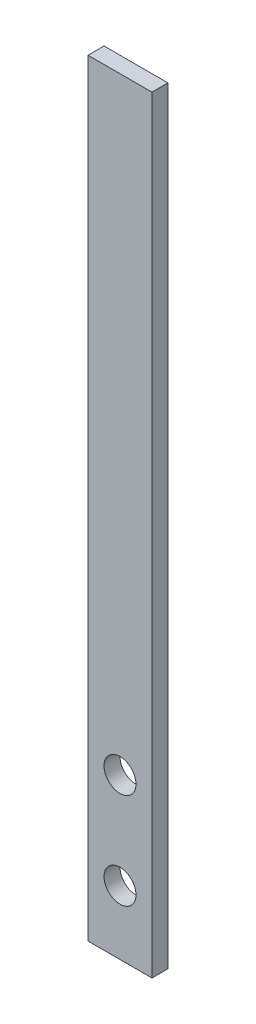
ISO-10303-21;
HEADER;
FILE_DESCRIPTION(('STEP AP214'),'2;1');
FILE_NAME('part.step','',(''),(''),'','','');
FILE_SCHEMA(('AUTOMOTIVE_DESIGN { 1 0 10303 214 1 1 1 1 }'));
ENDSEC;
DATA;
#1=APPLICATION_CONTEXT('core data for automotive mechanical design processes');
#2=APPLICATION_PROTOCOL_DEFINITION('international standard','automotive_design',2000,#1);
#3=PRODUCT_CONTEXT('',#1,'mechanical');
#4=PRODUCT('Part','Part','',(#3));
#5=PRODUCT_RELATED_PRODUCT_CATEGORY('part','',(#4));
#6=PRODUCT_DEFINITION_FORMATION('','',#4);
#7=PRODUCT_DEFINITION_CONTEXT('part definition',#1,'design');
#8=PRODUCT_DEFINITION('design','',#6,#7);
#9=PRODUCT_DEFINITION_SHAPE('','',#8);
#10=(LENGTH_UNIT() NAMED_UNIT(*) SI_UNIT(.MILLI.,.METRE.));
#11=(NAMED_UNIT(*) PLANE_ANGLE_UNIT() SI_UNIT($,.RADIAN.));
#12=(NAMED_UNIT(*) SI_UNIT($,.STERADIAN.) SOLID_ANGLE_UNIT());
#13=UNCERTAINTY_MEASURE_WITH_UNIT(LENGTH_MEASURE(1.E-05),#10,'distance_accuracy_value','');
#14=(GEOMETRIC_REPRESENTATION_CONTEXT(3) GLOBAL_UNCERTAINTY_ASSIGNED_CONTEXT((#13)) GLOBAL_UNIT_ASSIGNED_CONTEXT((#10,
#11,#12)) REPRESENTATION_CONTEXT('',''));
#15=CARTESIAN_POINT('',(0.,0.,0.));
#16=DIRECTION('',(0.,0.,1.));
#17=DIRECTION('',(1.,0.,0.));
#18=AXIS2_PLACEMENT_3D('',#15,#16,#17);
#19=CARTESIAN_POINT('',(0.,304.8,0.));
#20=DIRECTION('',(0.,0.,-1.));
#21=DIRECTION('',(-1.,0.,0.));
#22=AXIS2_PLACEMENT_3D('',#19,#20,#21);
#23=PLANE('',#22);
#24=CARTESIAN_POINT('',(12.7,63.5,0.));
#25=DIRECTION('',(0.,0.,1.));
#26=DIRECTION('',(1.,0.,0.));
#27=AXIS2_PLACEMENT_3D('',#24,#25,#26);
#28=CIRCLE('',#27,6.35);
#29=CARTESIAN_POINT('',(19.05,63.5,0.));
#30=VERTEX_POINT('',#29);
#31=EDGE_CURVE('E120',#30,#30,#28,.T.);
#32=ORIENTED_EDGE('',*,*,#31,.F.);
#33=EDGE_LOOP('',(#32));
#34=FACE_BOUND('',#33,.T.);
#35=CARTESIAN_POINT('',(12.7,25.4,0.));
#36=DIRECTION('',(0.,0.,1.));
#37=DIRECTION('',(1.,0.,0.));
#38=AXIS2_PLACEMENT_3D('',#35,#36,#37);
#39=CIRCLE('',#38,6.35);
#40=CARTESIAN_POINT('',(19.05,25.4,0.));
#41=VERTEX_POINT('',#40);
#42=EDGE_CURVE('E112',#41,#41,#39,.T.);
#43=ORIENTED_EDGE('',*,*,#42,.F.);
#44=EDGE_LOOP('',(#43));
#45=FACE_BOUND('',#44,.T.);
#46=DIRECTION('',(1.,0.,0.));
#47=VECTOR('',#46,1.);
#48=CARTESIAN_POINT('',(0.,0.,0.));
#49=LINE('',#48,#47);
#50=CARTESIAN_POINT('',(0.,0.,0.));
#51=VERTEX_POINT('',#50);
#52=CARTESIAN_POINT('',(25.4,0.,0.));
#53=VERTEX_POINT('',#52);
#54=EDGE_CURVE('E101',#51,#53,#49,.T.);
#55=ORIENTED_EDGE('',*,*,#54,.T.);
#56=DIRECTION('',(0.,-1.,0.));
#57=VECTOR('',#56,1.);
#58=CARTESIAN_POINT('',(25.4,304.8,0.));
#59=LINE('',#58,#57);
#60=CARTESIAN_POINT('',(25.4,304.8,0.));
#61=VERTEX_POINT('',#60);
#62=EDGE_CURVE('E11',#61,#53,#59,.T.);
#63=ORIENTED_EDGE('',*,*,#62,.F.);
#64=DIRECTION('',(1.,0.,0.));
#65=VECTOR('',#64,1.);
#66=CARTESIAN_POINT('',(0.,304.8,0.));
#67=LINE('',#66,#65);
#68=CARTESIAN_POINT('',(0.,304.8,0.));
#69=VERTEX_POINT('',#68);
#70=EDGE_CURVE('E86',#69,#61,#67,.T.);
#71=ORIENTED_EDGE('',*,*,#70,.F.);
#72=DIRECTION('',(0.,-1.,0.));
#73=VECTOR('',#72,1.);
#74=CARTESIAN_POINT('',(0.,304.8,0.));
#75=LINE('',#74,#73);
#76=EDGE_CURVE('E53',#69,#51,#75,.T.);
#77=ORIENTED_EDGE('',*,*,#76,.T.);
#78=EDGE_LOOP('',(#55,#63,#71,#77));
#79=FACE_BOUND('',#78,.T.);
#80=ADVANCED_FACE('F35',(#34,#45,#79),#23,.F.);
#81=CARTESIAN_POINT('',(25.4,304.8,0.));
#82=DIRECTION('',(-1.,0.,0.));
#83=DIRECTION('',(0.,0.,1.));
#84=AXIS2_PLACEMENT_3D('',#81,#82,#83);
#85=PLANE('',#84);
#86=DIRECTION('',(0.,0.,-1.));
#87=VECTOR('',#86,1.);
#88=CARTESIAN_POINT('',(25.4,0.,0.));
#89=LINE('',#88,#87);
#90=CARTESIAN_POINT('',(25.4,0.,-6.35));
#91=VERTEX_POINT('',#90);
#92=EDGE_CURVE('E91',#53,#91,#89,.T.);
#93=ORIENTED_EDGE('',*,*,#92,.T.);
#94=DIRECTION('',(0.,-1.,0.));
#95=VECTOR('',#94,1.);
#96=CARTESIAN_POINT('',(25.4,304.8,-6.35));
#97=LINE('',#96,#95);
#98=CARTESIAN_POINT('',(25.4,304.8,-6.35));
#99=VERTEX_POINT('',#98);
#100=EDGE_CURVE('E44',#99,#91,#97,.T.);
#101=ORIENTED_EDGE('',*,*,#100,.F.);
#102=DIRECTION('',(0.,0.,-1.));
#103=VECTOR('',#102,1.);
#104=CARTESIAN_POINT('',(25.4,304.8,0.));
#105=LINE('',#104,#103);
#106=EDGE_CURVE('E78',#61,#99,#105,.T.);
#107=ORIENTED_EDGE('',*,*,#106,.F.);
#108=ORIENTED_EDGE('',*,*,#62,.T.);
#109=EDGE_LOOP('',(#93,#101,#107,#108));
#110=FACE_BOUND('',#109,.T.);
#111=ADVANCED_FACE('F90',(#110),#85,.F.);
#112=CARTESIAN_POINT('',(0.,304.8,-6.35));
#113=DIRECTION('',(0.,0.,-1.));
#114=DIRECTION('',(-1.,0.,0.));
#115=AXIS2_PLACEMENT_3D('',#112,#113,#114);
#116=PLANE('',#115);
#117=CARTESIAN_POINT('',(12.7,63.5,-6.35000000000002));
#118=DIRECTION('',(0.,0.,-1.));
#119=DIRECTION('',(-1.,0.,0.));
#120=AXIS2_PLACEMENT_3D('',#117,#118,#119);
#121=CIRCLE('',#120,6.35);
#122=CARTESIAN_POINT('',(6.35,63.5,-6.35000000000002));
#123=VERTEX_POINT('',#122);
#124=EDGE_CURVE('E38',#123,#123,#121,.T.);
#125=ORIENTED_EDGE('',*,*,#124,.F.);
#126=EDGE_LOOP('',(#125));
#127=FACE_BOUND('',#126,.T.);
#128=CARTESIAN_POINT('',(12.7,25.4,-6.35000000000002));
#129=DIRECTION('',(0.,0.,-1.));
#130=DIRECTION('',(-1.,0.,0.));
#131=AXIS2_PLACEMENT_3D('',#128,#129,#130);
#132=CIRCLE('',#131,6.35);
#133=CARTESIAN_POINT('',(6.35,25.4,-6.35000000000002));
#134=VERTEX_POINT('',#133);
#135=EDGE_CURVE('E103',#134,#134,#132,.T.);
#136=ORIENTED_EDGE('',*,*,#135,.F.);
#137=EDGE_LOOP('',(#136));
#138=FACE_BOUND('',#137,.T.);
#139=DIRECTION('',(1.,0.,0.));
#140=VECTOR('',#139,1.);
#141=CARTESIAN_POINT('',(0.,0.,-6.35));
#142=LINE('',#141,#140);
#143=CARTESIAN_POINT('',(0.,0.,-6.35));
#144=VERTEX_POINT('',#143);
#145=EDGE_CURVE('E105',#144,#91,#142,.T.);
#146=ORIENTED_EDGE('',*,*,#145,.F.);
#147=DIRECTION('',(0.,-1.,0.));
#148=VECTOR('',#147,1.);
#149=CARTESIAN_POINT('',(0.,304.8,-6.35));
#150=LINE('',#149,#148);
#151=CARTESIAN_POINT('',(0.,304.8,-6.35));
#152=VERTEX_POINT('',#151);
#153=EDGE_CURVE('E67',#152,#144,#150,.T.);
#154=ORIENTED_EDGE('',*,*,#153,.F.);
#155=DIRECTION('',(1.,0.,0.));
#156=VECTOR('',#155,1.);
#157=CARTESIAN_POINT('',(0.,304.8,-6.35));
#158=LINE('',#157,#156);
#159=EDGE_CURVE('E85',#152,#99,#158,.T.);
#160=ORIENTED_EDGE('',*,*,#159,.T.);
#161=ORIENTED_EDGE('',*,*,#100,.T.);
#162=EDGE_LOOP('',(#146,#154,#160,#161));
#163=FACE_BOUND('',#162,.T.);
#164=ADVANCED_FACE('F95',(#127,#138,#163),#116,.T.);
#165=CARTESIAN_POINT('',(0.,304.8,0.));
#166=DIRECTION('',(-1.,0.,0.));
#167=DIRECTION('',(0.,0.,1.));
#168=AXIS2_PLACEMENT_3D('',#165,#166,#167);
#169=PLANE('',#168);
#170=DIRECTION('',(0.,0.,-1.));
#171=VECTOR('',#170,1.);
#172=CARTESIAN_POINT('',(0.,0.,0.));
#173=LINE('',#172,#171);
#174=EDGE_CURVE('E107',#51,#144,#173,.T.);
#175=ORIENTED_EDGE('',*,*,#174,.F.);
#176=ORIENTED_EDGE('',*,*,#76,.F.);
#177=DIRECTION('',(0.,0.,-1.));
#178=VECTOR('',#177,1.);
#179=CARTESIAN_POINT('',(0.,304.8,0.));
#180=LINE('',#179,#178);
#181=EDGE_CURVE('E96',#69,#152,#180,.T.);
#182=ORIENTED_EDGE('',*,*,#181,.T.);
#183=ORIENTED_EDGE('',*,*,#153,.T.);
#184=EDGE_LOOP('',(#175,#176,#182,#183));
#185=FACE_BOUND('',#184,.T.);
#186=ADVANCED_FACE('F131',(#185),#169,.T.);
#187=CARTESIAN_POINT('',(0.,304.8,0.));
#188=DIRECTION('',(0.,1.,0.));
#189=DIRECTION('',(0.,0.,1.));
#190=AXIS2_PLACEMENT_3D('',#187,#188,#189);
#191=PLANE('',#190);
#192=ORIENTED_EDGE('',*,*,#70,.T.);
#193=ORIENTED_EDGE('',*,*,#106,.T.);
#194=ORIENTED_EDGE('',*,*,#159,.F.);
#195=ORIENTED_EDGE('',*,*,#181,.F.);
#196=EDGE_LOOP('',(#192,#193,#194,#195));
#197=FACE_BOUND('',#196,.T.);
#198=ADVANCED_FACE('F82',(#197),#191,.T.);
#199=CARTESIAN_POINT('',(0.,0.,0.));
#200=DIRECTION('',(0.,1.,0.));
#201=DIRECTION('',(0.,0.,1.));
#202=AXIS2_PLACEMENT_3D('',#199,#200,#201);
#203=PLANE('',#202);
#204=ORIENTED_EDGE('',*,*,#54,.F.);
#205=ORIENTED_EDGE('',*,*,#174,.T.);
#206=ORIENTED_EDGE('',*,*,#145,.T.);
#207=ORIENTED_EDGE('',*,*,#92,.F.);
#208=EDGE_LOOP('',(#204,#205,#206,#207));
#209=FACE_BOUND('',#208,.T.);
#210=ADVANCED_FACE('F130',(#209),#203,.F.);
#211=CARTESIAN_POINT('',(12.7,25.4,-355.6));
#212=DIRECTION('',(0.,0.,1.));
#213=DIRECTION('',(1.,0.,0.));
#214=AXIS2_PLACEMENT_3D('',#211,#212,#213);
#215=CYLINDRICAL_SURFACE('',#214,6.35);
#216=ORIENTED_EDGE('',*,*,#135,.T.);
#217=EDGE_LOOP('',(#216));
#218=FACE_BOUND('',#217,.T.);
#219=ORIENTED_EDGE('',*,*,#42,.T.);
#220=EDGE_LOOP('',(#219));
#221=FACE_BOUND('',#220,.T.);
#222=ADVANCED_FACE('F160',(#218,#221),#215,.F.);
#223=CARTESIAN_POINT('',(12.7,63.5,-355.6));
#224=DIRECTION('',(0.,0.,1.));
#225=DIRECTION('',(1.,0.,0.));
#226=AXIS2_PLACEMENT_3D('',#223,#224,#225);
#227=CYLINDRICAL_SURFACE('',#226,6.35);
#228=ORIENTED_EDGE('',*,*,#124,.T.);
#229=EDGE_LOOP('',(#228));
#230=FACE_BOUND('',#229,.T.);
#231=ORIENTED_EDGE('',*,*,#31,.T.);
#232=EDGE_LOOP('',(#231));
#233=FACE_BOUND('',#232,.T.);
#234=ADVANCED_FACE('F125',(#230,#233),#227,.F.);
#235=CLOSED_SHELL('',(#80,#111,#164,#186,#198,#210,#222,#234));
#236=MANIFOLD_SOLID_BREP('B2',#235);
#237=ADVANCED_BREP_SHAPE_REPRESENTATION('',(#18,#236),#14);
#238=SHAPE_DEFINITION_REPRESENTATION(#9,#237);
ENDSEC;
END-ISO-10303-21;
